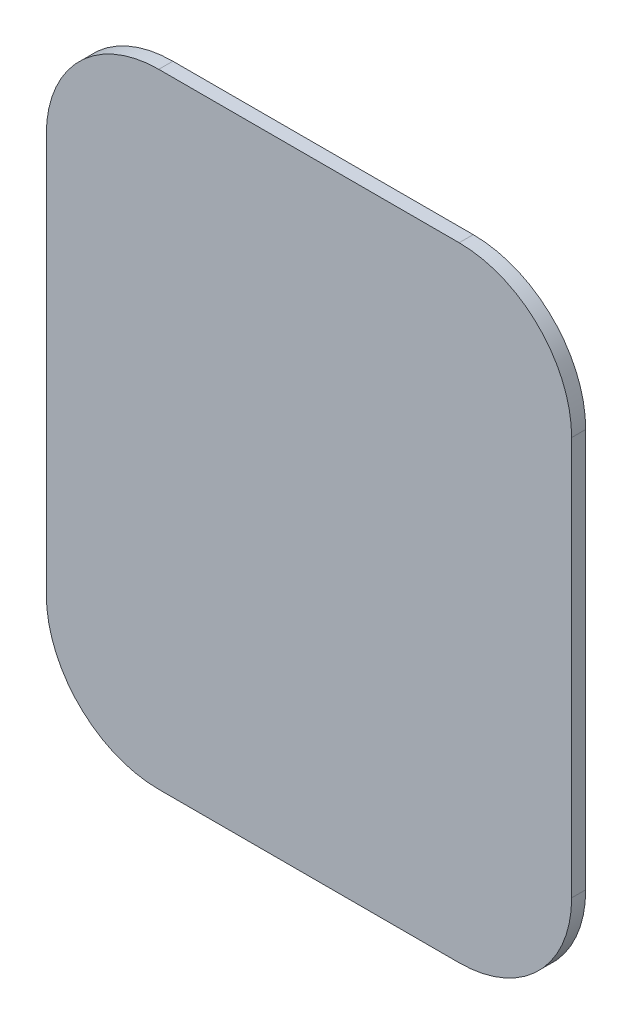
ISO-10303-21;
HEADER;
FILE_DESCRIPTION(('STEP AP214'),'2;1');
FILE_NAME('part.step','',(''),(''),'','','');
FILE_SCHEMA(('AUTOMOTIVE_DESIGN { 1 0 10303 214 1 1 1 1 }'));
ENDSEC;
DATA;
#1=APPLICATION_CONTEXT('core data for automotive mechanical design processes');
#2=APPLICATION_PROTOCOL_DEFINITION('international standard','automotive_design',2000,#1);
#3=PRODUCT_CONTEXT('',#1,'mechanical');
#4=PRODUCT('Part','Part','',(#3));
#5=PRODUCT_RELATED_PRODUCT_CATEGORY('part','',(#4));
#6=PRODUCT_DEFINITION_FORMATION('','',#4);
#7=PRODUCT_DEFINITION_CONTEXT('part definition',#1,'design');
#8=PRODUCT_DEFINITION('design','',#6,#7);
#9=PRODUCT_DEFINITION_SHAPE('','',#8);
#10=(LENGTH_UNIT() NAMED_UNIT(*) SI_UNIT(.MILLI.,.METRE.));
#11=(NAMED_UNIT(*) PLANE_ANGLE_UNIT() SI_UNIT($,.RADIAN.));
#12=(NAMED_UNIT(*) SI_UNIT($,.STERADIAN.) SOLID_ANGLE_UNIT());
#13=UNCERTAINTY_MEASURE_WITH_UNIT(LENGTH_MEASURE(1.E-05),#10,'distance_accuracy_value','');
#14=(GEOMETRIC_REPRESENTATION_CONTEXT(3) GLOBAL_UNCERTAINTY_ASSIGNED_CONTEXT((#13)) GLOBAL_UNIT_ASSIGNED_CONTEXT((#10,
#11,#12)) REPRESENTATION_CONTEXT('',''));
#15=CARTESIAN_POINT('',(0.,0.,0.));
#16=DIRECTION('',(0.,0.,1.));
#17=DIRECTION('',(1.,0.,0.));
#18=AXIS2_PLACEMENT_3D('',#15,#16,#17);
#19=CARTESIAN_POINT('',(0.,22.17637267,1.));
#20=DIRECTION('',(0.,1.,0.));
#21=DIRECTION('',(0.,0.,1.));
#22=AXIS2_PLACEMENT_3D('',#19,#20,#21);
#23=PLANE('',#22);
#24=DIRECTION('',(1.,0.,0.));
#25=VECTOR('',#24,1.);
#26=CARTESIAN_POINT('',(0.,22.17637267,0.));
#27=LINE('',#26,#25);
#28=CARTESIAN_POINT('',(-10.6826988981117,22.17637267,0.));
#29=VERTEX_POINT('',#28);
#30=CARTESIAN_POINT('',(10.6826988981117,22.17637267,0.));
#31=VERTEX_POINT('',#30);
#32=EDGE_CURVE('E135',#29,#31,#27,.T.);
#33=ORIENTED_EDGE('',*,*,#32,.F.);
#34=DIRECTION('',(0.,0.,-1.));
#35=VECTOR('',#34,1.);
#36=CARTESIAN_POINT('',(-10.6826988981117,22.17637267,1.));
#37=LINE('',#36,#35);
#38=CARTESIAN_POINT('',(-10.6826988981117,22.17637267,1.));
#39=VERTEX_POINT('',#38);
#40=EDGE_CURVE('E11',#39,#29,#37,.T.);
#41=ORIENTED_EDGE('',*,*,#40,.F.);
#42=DIRECTION('',(1.,0.,0.));
#43=VECTOR('',#42,1.);
#44=CARTESIAN_POINT('',(0.,22.17637267,1.));
#45=LINE('',#44,#43);
#46=CARTESIAN_POINT('',(10.6826988981117,22.17637267,1.));
#47=VERTEX_POINT('',#46);
#48=EDGE_CURVE('E151',#39,#47,#45,.T.);
#49=ORIENTED_EDGE('',*,*,#48,.T.);
#50=DIRECTION('',(0.,0.,-1.));
#51=VECTOR('',#50,1.);
#52=CARTESIAN_POINT('',(10.6826988981117,22.17637267,1.));
#53=LINE('',#52,#51);
#54=EDGE_CURVE('E57',#47,#31,#53,.T.);
#55=ORIENTED_EDGE('',*,*,#54,.T.);
#56=EDGE_LOOP('',(#33,#41,#49,#55));
#57=FACE_BOUND('',#56,.T.);
#58=ADVANCED_FACE('F41',(#57),#23,.T.);
#59=CARTESIAN_POINT('',(-10.6826988981117,14.17637267,1.));
#60=DIRECTION('',(0.,0.,-1.));
#61=DIRECTION('',(-1.,0.,0.));
#62=AXIS2_PLACEMENT_3D('',#59,#60,#61);
#63=CYLINDRICAL_SURFACE('',#62,8.);
#64=CARTESIAN_POINT('',(-10.6826988981117,14.17637267,0.));
#65=DIRECTION('',(0.,0.,1.));
#66=DIRECTION('',(1.,0.,0.));
#67=AXIS2_PLACEMENT_3D('',#64,#65,#66);
#68=CIRCLE('',#67,8.);
#69=CARTESIAN_POINT('',(-18.6826988981117,14.1763726699999,0.));
#70=VERTEX_POINT('',#69);
#71=EDGE_CURVE('E137',#29,#70,#68,.T.);
#72=ORIENTED_EDGE('',*,*,#71,.T.);
#73=DIRECTION('',(0.,0.,-1.));
#74=VECTOR('',#73,1.);
#75=CARTESIAN_POINT('',(-18.6826988981117,14.1763726699999,1.));
#76=LINE('',#75,#74);
#77=CARTESIAN_POINT('',(-18.6826988981117,14.1763726699999,1.));
#78=VERTEX_POINT('',#77);
#79=EDGE_CURVE('E49',#78,#70,#76,.T.);
#80=ORIENTED_EDGE('',*,*,#79,.F.);
#81=CARTESIAN_POINT('',(-10.6826988981117,14.17637267,1.));
#82=DIRECTION('',(0.,0.,1.));
#83=DIRECTION('',(1.,0.,0.));
#84=AXIS2_PLACEMENT_3D('',#81,#82,#83);
#85=CIRCLE('',#84,8.);
#86=EDGE_CURVE('E184',#39,#78,#85,.T.);
#87=ORIENTED_EDGE('',*,*,#86,.F.);
#88=ORIENTED_EDGE('',*,*,#40,.T.);
#89=EDGE_LOOP('',(#72,#80,#87,#88));
#90=FACE_BOUND('',#89,.T.);
#91=ADVANCED_FACE('F197',(#90),#63,.T.);
#92=CARTESIAN_POINT('',(-18.6826988981117,0.,1.));
#93=DIRECTION('',(1.,0.,0.));
#94=DIRECTION('',(0.,0.,-1.));
#95=AXIS2_PLACEMENT_3D('',#92,#93,#94);
#96=PLANE('',#95);
#97=DIRECTION('',(0.,-1.,0.));
#98=VECTOR('',#97,1.);
#99=CARTESIAN_POINT('',(-18.6826988981117,0.,0.));
#100=LINE('',#99,#98);
#101=CARTESIAN_POINT('',(-18.6826988981117,-14.1763726699999,0.));
#102=VERTEX_POINT('',#101);
#103=EDGE_CURVE('E139',#70,#102,#100,.T.);
#104=ORIENTED_EDGE('',*,*,#103,.T.);
#105=DIRECTION('',(0.,0.,-1.));
#106=VECTOR('',#105,1.);
#107=CARTESIAN_POINT('',(-18.6826988981117,-14.1763726699999,1.));
#108=LINE('',#107,#106);
#109=CARTESIAN_POINT('',(-18.6826988981117,-14.1763726699999,1.));
#110=VERTEX_POINT('',#109);
#111=EDGE_CURVE('E158',#110,#102,#108,.T.);
#112=ORIENTED_EDGE('',*,*,#111,.F.);
#113=DIRECTION('',(0.,-1.,0.));
#114=VECTOR('',#113,1.);
#115=CARTESIAN_POINT('',(-18.6826988981117,0.,1.));
#116=LINE('',#115,#114);
#117=EDGE_CURVE('E167',#78,#110,#116,.T.);
#118=ORIENTED_EDGE('',*,*,#117,.F.);
#119=ORIENTED_EDGE('',*,*,#79,.T.);
#120=EDGE_LOOP('',(#104,#112,#118,#119));
#121=FACE_BOUND('',#120,.T.);
#122=ADVANCED_FACE('F165',(#121),#96,.F.);
#123=CARTESIAN_POINT('',(-10.6826988981117,-14.17637267,1.));
#124=DIRECTION('',(0.,0.,-1.));
#125=DIRECTION('',(-1.,0.,0.));
#126=AXIS2_PLACEMENT_3D('',#123,#124,#125);
#127=CYLINDRICAL_SURFACE('',#126,8.);
#128=CARTESIAN_POINT('',(-10.6826988981117,-14.17637267,0.));
#129=DIRECTION('',(0.,0.,1.));
#130=DIRECTION('',(1.,0.,0.));
#131=AXIS2_PLACEMENT_3D('',#128,#129,#130);
#132=CIRCLE('',#131,8.);
#133=CARTESIAN_POINT('',(-10.6826988981117,-22.17637267,0.));
#134=VERTEX_POINT('',#133);
#135=EDGE_CURVE('E141',#102,#134,#132,.T.);
#136=ORIENTED_EDGE('',*,*,#135,.T.);
#137=DIRECTION('',(0.,0.,-1.));
#138=VECTOR('',#137,1.);
#139=CARTESIAN_POINT('',(-10.6826988981117,-22.17637267,1.));
#140=LINE('',#139,#138);
#141=CARTESIAN_POINT('',(-10.6826988981117,-22.17637267,1.));
#142=VERTEX_POINT('',#141);
#143=EDGE_CURVE('E155',#142,#134,#140,.T.);
#144=ORIENTED_EDGE('',*,*,#143,.F.);
#145=CARTESIAN_POINT('',(-10.6826988981117,-14.17637267,1.));
#146=DIRECTION('',(0.,0.,1.));
#147=DIRECTION('',(1.,0.,0.));
#148=AXIS2_PLACEMENT_3D('',#145,#146,#147);
#149=CIRCLE('',#148,8.);
#150=EDGE_CURVE('E180',#110,#142,#149,.T.);
#151=ORIENTED_EDGE('',*,*,#150,.F.);
#152=ORIENTED_EDGE('',*,*,#111,.T.);
#153=EDGE_LOOP('',(#136,#144,#151,#152));
#154=FACE_BOUND('',#153,.T.);
#155=ADVANCED_FACE('F176',(#154),#127,.T.);
#156=CARTESIAN_POINT('',(0.,-22.17637267,1.));
#157=DIRECTION('',(0.,1.,0.));
#158=DIRECTION('',(0.,0.,1.));
#159=AXIS2_PLACEMENT_3D('',#156,#157,#158);
#160=PLANE('',#159);
#161=DIRECTION('',(1.,0.,0.));
#162=VECTOR('',#161,1.);
#163=CARTESIAN_POINT('',(0.,-22.17637267,0.));
#164=LINE('',#163,#162);
#165=CARTESIAN_POINT('',(10.6826988981117,-22.17637267,0.));
#166=VERTEX_POINT('',#165);
#167=EDGE_CURVE('E143',#134,#166,#164,.T.);
#168=ORIENTED_EDGE('',*,*,#167,.T.);
#169=DIRECTION('',(0.,0.,-1.));
#170=VECTOR('',#169,1.);
#171=CARTESIAN_POINT('',(10.6826988981117,-22.17637267,1.));
#172=LINE('',#171,#170);
#173=CARTESIAN_POINT('',(10.6826988981117,-22.17637267,1.));
#174=VERTEX_POINT('',#173);
#175=EDGE_CURVE('E127',#174,#166,#172,.T.);
#176=ORIENTED_EDGE('',*,*,#175,.F.);
#177=DIRECTION('',(1.,0.,0.));
#178=VECTOR('',#177,1.);
#179=CARTESIAN_POINT('',(0.,-22.17637267,1.));
#180=LINE('',#179,#178);
#181=EDGE_CURVE('E115',#142,#174,#180,.T.);
#182=ORIENTED_EDGE('',*,*,#181,.F.);
#183=ORIENTED_EDGE('',*,*,#143,.T.);
#184=EDGE_LOOP('',(#168,#176,#182,#183));
#185=FACE_BOUND('',#184,.T.);
#186=ADVANCED_FACE('F179',(#185),#160,.F.);
#187=CARTESIAN_POINT('',(10.6826988981117,-14.17637267,1.));
#188=DIRECTION('',(0.,0.,-1.));
#189=DIRECTION('',(-1.,0.,0.));
#190=AXIS2_PLACEMENT_3D('',#187,#188,#189);
#191=CYLINDRICAL_SURFACE('',#190,8.);
#192=CARTESIAN_POINT('',(10.6826988981117,-14.17637267,0.));
#193=DIRECTION('',(0.,0.,1.));
#194=DIRECTION('',(1.,0.,0.));
#195=AXIS2_PLACEMENT_3D('',#192,#193,#194);
#196=CIRCLE('',#195,8.);
#197=CARTESIAN_POINT('',(18.6826988981117,-14.1763726699999,0.));
#198=VERTEX_POINT('',#197);
#199=EDGE_CURVE('E124',#166,#198,#196,.T.);
#200=ORIENTED_EDGE('',*,*,#199,.T.);
#201=DIRECTION('',(0.,0.,-1.));
#202=VECTOR('',#201,1.);
#203=CARTESIAN_POINT('',(18.6826988981117,-14.1763726699999,1.));
#204=LINE('',#203,#202);
#205=CARTESIAN_POINT('',(18.6826988981117,-14.1763726699999,1.));
#206=VERTEX_POINT('',#205);
#207=EDGE_CURVE('E121',#206,#198,#204,.T.);
#208=ORIENTED_EDGE('',*,*,#207,.F.);
#209=CARTESIAN_POINT('',(10.6826988981117,-14.17637267,1.));
#210=DIRECTION('',(0.,0.,1.));
#211=DIRECTION('',(1.,0.,0.));
#212=AXIS2_PLACEMENT_3D('',#209,#210,#211);
#213=CIRCLE('',#212,8.);
#214=EDGE_CURVE('E107',#174,#206,#213,.T.);
#215=ORIENTED_EDGE('',*,*,#214,.F.);
#216=ORIENTED_EDGE('',*,*,#175,.T.);
#217=EDGE_LOOP('',(#200,#208,#215,#216));
#218=FACE_BOUND('',#217,.T.);
#219=ADVANCED_FACE('F122',(#218),#191,.T.);
#220=CARTESIAN_POINT('',(18.6826988981117,0.,1.));
#221=DIRECTION('',(1.,0.,0.));
#222=DIRECTION('',(0.,0.,-1.));
#223=AXIS2_PLACEMENT_3D('',#220,#221,#222);
#224=PLANE('',#223);
#225=DIRECTION('',(0.,-1.,0.));
#226=VECTOR('',#225,1.);
#227=CARTESIAN_POINT('',(18.6826988981117,0.,0.));
#228=LINE('',#227,#226);
#229=CARTESIAN_POINT('',(18.6826988981117,14.1763726699999,0.));
#230=VERTEX_POINT('',#229);
#231=EDGE_CURVE('E146',#230,#198,#228,.T.);
#232=ORIENTED_EDGE('',*,*,#231,.F.);
#233=DIRECTION('',(0.,0.,-1.));
#234=VECTOR('',#233,1.);
#235=CARTESIAN_POINT('',(18.6826988981117,14.1763726699999,1.));
#236=LINE('',#235,#234);
#237=CARTESIAN_POINT('',(18.6826988981117,14.1763726699999,1.));
#238=VERTEX_POINT('',#237);
#239=EDGE_CURVE('E82',#238,#230,#236,.T.);
#240=ORIENTED_EDGE('',*,*,#239,.F.);
#241=DIRECTION('',(0.,-1.,0.));
#242=VECTOR('',#241,1.);
#243=CARTESIAN_POINT('',(18.6826988981117,0.,1.));
#244=LINE('',#243,#242);
#245=EDGE_CURVE('E113',#238,#206,#244,.T.);
#246=ORIENTED_EDGE('',*,*,#245,.T.);
#247=ORIENTED_EDGE('',*,*,#207,.T.);
#248=EDGE_LOOP('',(#232,#240,#246,#247));
#249=FACE_BOUND('',#248,.T.);
#250=ADVANCED_FACE('F129',(#249),#224,.T.);
#251=CARTESIAN_POINT('',(10.6826988981117,14.17637267,1.));
#252=DIRECTION('',(0.,0.,-1.));
#253=DIRECTION('',(-1.,0.,0.));
#254=AXIS2_PLACEMENT_3D('',#251,#252,#253);
#255=CYLINDRICAL_SURFACE('',#254,8.);
#256=CARTESIAN_POINT('',(10.6826988981117,14.17637267,0.));
#257=DIRECTION('',(0.,0.,1.));
#258=DIRECTION('',(1.,0.,0.));
#259=AXIS2_PLACEMENT_3D('',#256,#257,#258);
#260=CIRCLE('',#259,8.);
#261=EDGE_CURVE('E148',#31,#230,#260,.F.);
#262=ORIENTED_EDGE('',*,*,#261,.F.);
#263=ORIENTED_EDGE('',*,*,#54,.F.);
#264=CARTESIAN_POINT('',(10.6826988981117,14.17637267,1.));
#265=DIRECTION('',(0.,0.,1.));
#266=DIRECTION('',(1.,0.,0.));
#267=AXIS2_PLACEMENT_3D('',#264,#265,#266);
#268=CIRCLE('',#267,8.);
#269=EDGE_CURVE('E130',#47,#238,#268,.F.);
#270=ORIENTED_EDGE('',*,*,#269,.T.);
#271=ORIENTED_EDGE('',*,*,#239,.T.);
#272=EDGE_LOOP('',(#262,#263,#270,#271));
#273=FACE_BOUND('',#272,.T.);
#274=ADVANCED_FACE('F186',(#273),#255,.T.);
#275=CARTESIAN_POINT('',(0.,0.,1.));
#276=DIRECTION('',(0.,0.,1.));
#277=DIRECTION('',(1.,0.,0.));
#278=AXIS2_PLACEMENT_3D('',#275,#276,#277);
#279=PLANE('',#278);
#280=ORIENTED_EDGE('',*,*,#48,.F.);
#281=ORIENTED_EDGE('',*,*,#86,.T.);
#282=ORIENTED_EDGE('',*,*,#117,.T.);
#283=ORIENTED_EDGE('',*,*,#150,.T.);
#284=ORIENTED_EDGE('',*,*,#181,.T.);
#285=ORIENTED_EDGE('',*,*,#214,.T.);
#286=ORIENTED_EDGE('',*,*,#245,.F.);
#287=ORIENTED_EDGE('',*,*,#269,.F.);
#288=EDGE_LOOP('',(#280,#281,#282,#283,#284,#285,#286,#287));
#289=FACE_BOUND('',#288,.T.);
#290=ADVANCED_FACE('F110',(#289),#279,.T.);
#291=CARTESIAN_POINT('',(0.,0.,0.));
#292=DIRECTION('',(0.,0.,1.));
#293=DIRECTION('',(1.,0.,0.));
#294=AXIS2_PLACEMENT_3D('',#291,#292,#293);
#295=PLANE('',#294);
#296=ORIENTED_EDGE('',*,*,#32,.T.);
#297=ORIENTED_EDGE('',*,*,#261,.T.);
#298=ORIENTED_EDGE('',*,*,#231,.T.);
#299=ORIENTED_EDGE('',*,*,#199,.F.);
#300=ORIENTED_EDGE('',*,*,#167,.F.);
#301=ORIENTED_EDGE('',*,*,#135,.F.);
#302=ORIENTED_EDGE('',*,*,#103,.F.);
#303=ORIENTED_EDGE('',*,*,#71,.F.);
#304=EDGE_LOOP('',(#296,#297,#298,#299,#300,#301,#302,#303));
#305=FACE_BOUND('',#304,.T.);
#306=ADVANCED_FACE('F172',(#305),#295,.F.);
#307=CLOSED_SHELL('',(#58,#91,#122,#155,#186,#219,#250,#274,#290,#306));
#308=MANIFOLD_SOLID_BREP('B2',#307);
#309=ADVANCED_BREP_SHAPE_REPRESENTATION('',(#18,#308),#14);
#310=SHAPE_DEFINITION_REPRESENTATION(#9,#309);
ENDSEC;
END-ISO-10303-21;
